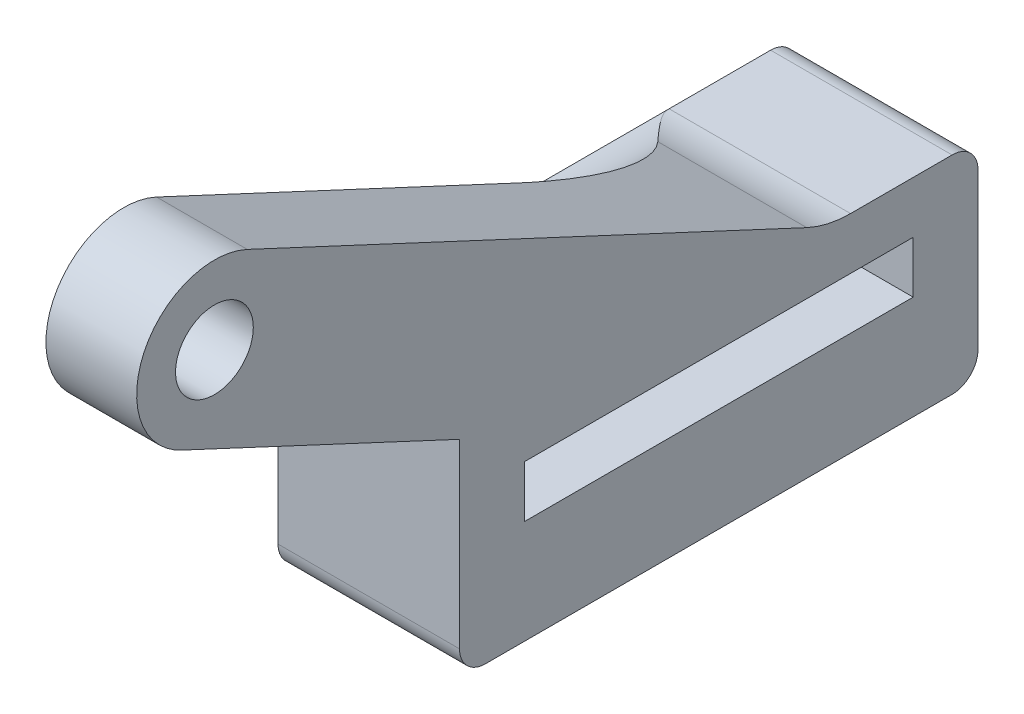
ISO-10303-21;
HEADER;
FILE_DESCRIPTION(('STEP AP214'),'2;1');
FILE_NAME('part.step','',(''),(''),'','','');
FILE_SCHEMA(('AUTOMOTIVE_DESIGN { 1 0 10303 214 1 1 1 1 }'));
ENDSEC;
DATA;
#1=APPLICATION_CONTEXT('core data for automotive mechanical design processes');
#2=APPLICATION_PROTOCOL_DEFINITION('international standard','automotive_design',2000,#1);
#3=PRODUCT_CONTEXT('',#1,'mechanical');
#4=PRODUCT('Part','Part','',(#3));
#5=PRODUCT_RELATED_PRODUCT_CATEGORY('part','',(#4));
#6=PRODUCT_DEFINITION_FORMATION('','',#4);
#7=PRODUCT_DEFINITION_CONTEXT('part definition',#1,'design');
#8=PRODUCT_DEFINITION('design','',#6,#7);
#9=PRODUCT_DEFINITION_SHAPE('','',#8);
#10=(LENGTH_UNIT() NAMED_UNIT(*) SI_UNIT(.MILLI.,.METRE.));
#11=(NAMED_UNIT(*) PLANE_ANGLE_UNIT() SI_UNIT($,.RADIAN.));
#12=(NAMED_UNIT(*) SI_UNIT($,.STERADIAN.) SOLID_ANGLE_UNIT());
#13=UNCERTAINTY_MEASURE_WITH_UNIT(LENGTH_MEASURE(1.E-05),#10,'distance_accuracy_value','');
#14=(GEOMETRIC_REPRESENTATION_CONTEXT(3) GLOBAL_UNCERTAINTY_ASSIGNED_CONTEXT((#13)) GLOBAL_UNIT_ASSIGNED_CONTEXT((#10,
#11,#12)) REPRESENTATION_CONTEXT('',''));
#15=CARTESIAN_POINT('',(0.,0.,0.));
#16=DIRECTION('',(0.,0.,1.));
#17=DIRECTION('',(1.,0.,0.));
#18=AXIS2_PLACEMENT_3D('',#15,#16,#17);
#19=CARTESIAN_POINT('',(3.5,11.7189233611099,19.4546798173259));
#20=DIRECTION('',(1.,0.,0.));
#21=DIRECTION('',(0.,0.,-1.));
#22=AXIS2_PLACEMENT_3D('',#19,#20,#21);
#23=PLANE('',#22);
#24=DIRECTION('',(0.,0.,1.));
#25=VECTOR('',#24,1.);
#26=CARTESIAN_POINT('',(3.5,2.,7.5));
#27=LINE('',#26,#25);
#28=CARTESIAN_POINT('',(3.5,2.,-7.5));
#29=VERTEX_POINT('',#28);
#30=CARTESIAN_POINT('',(3.5,2.,7.5));
#31=VERTEX_POINT('',#30);
#32=EDGE_CURVE('E331',#29,#31,#27,.T.);
#33=ORIENTED_EDGE('',*,*,#32,.F.);
#34=DIRECTION('',(0.,1.,0.));
#35=VECTOR('',#34,1.);
#36=CARTESIAN_POINT('',(3.5,2.,-7.5));
#37=LINE('',#36,#35);
#38=CARTESIAN_POINT('',(3.5,0.,-7.5));
#39=VERTEX_POINT('',#38);
#40=EDGE_CURVE('E329',#39,#29,#37,.T.);
#41=ORIENTED_EDGE('',*,*,#40,.F.);
#42=DIRECTION('',(0.,0.,-1.));
#43=VECTOR('',#42,1.);
#44=CARTESIAN_POINT('',(3.5,0.,7.5));
#45=LINE('',#44,#43);
#46=CARTESIAN_POINT('',(3.5,0.,7.5));
#47=VERTEX_POINT('',#46);
#48=EDGE_CURVE('E337',#47,#39,#45,.T.);
#49=ORIENTED_EDGE('',*,*,#48,.F.);
#50=DIRECTION('',(0.,-1.,0.));
#51=VECTOR('',#50,1.);
#52=CARTESIAN_POINT('',(3.5,2.,7.5));
#53=LINE('',#52,#51);
#54=EDGE_CURVE('E334',#31,#47,#53,.T.);
#55=ORIENTED_EDGE('',*,*,#54,.F.);
#56=EDGE_LOOP('',(#33,#41,#49,#55));
#57=FACE_BOUND('',#56,.T.);
#58=DIRECTION('',(0.,0.,-1.));
#59=VECTOR('',#58,1.);
#60=CARTESIAN_POINT('',(3.5,-4.,10.));
#61=LINE('',#60,#59);
#62=CARTESIAN_POINT('',(3.5,-4.,9.));
#63=VERTEX_POINT('',#62);
#64=CARTESIAN_POINT('',(3.5,-4.,-9.));
#65=VERTEX_POINT('',#64);
#66=EDGE_CURVE('E293',#63,#65,#61,.T.);
#67=ORIENTED_EDGE('',*,*,#66,.T.);
#68=CARTESIAN_POINT('',(3.5,-3.,-9.));
#69=DIRECTION('',(1.,0.,0.));
#70=DIRECTION('',(0.,0.,-1.));
#71=AXIS2_PLACEMENT_3D('',#68,#69,#70);
#72=CIRCLE('',#71,1.);
#73=CARTESIAN_POINT('',(3.5,-3.,-10.));
#74=VERTEX_POINT('',#73);
#75=EDGE_CURVE('E274',#65,#74,#72,.T.);
#76=ORIENTED_EDGE('',*,*,#75,.T.);
#77=DIRECTION('',(0.,1.,0.));
#78=VECTOR('',#77,1.);
#79=CARTESIAN_POINT('',(3.5,4.,-10.));
#80=LINE('',#79,#78);
#81=CARTESIAN_POINT('',(3.5,3.,-10.));
#82=VERTEX_POINT('',#81);
#83=EDGE_CURVE('E263',#74,#82,#80,.T.);
#84=ORIENTED_EDGE('',*,*,#83,.T.);
#85=CARTESIAN_POINT('',(3.5,3.,-9.));
#86=DIRECTION('',(1.,0.,0.));
#87=DIRECTION('',(0.,0.,-1.));
#88=AXIS2_PLACEMENT_3D('',#85,#86,#87);
#89=CIRCLE('',#88,1.);
#90=CARTESIAN_POINT('',(3.5,4.,-9.));
#91=VERTEX_POINT('',#90);
#92=EDGE_CURVE('E54',#82,#91,#89,.T.);
#93=ORIENTED_EDGE('',*,*,#92,.T.);
#94=DIRECTION('',(0.,0.,1.));
#95=VECTOR('',#94,1.);
#96=CARTESIAN_POINT('',(3.5,4.,-4.19720949891519));
#97=LINE('',#96,#95);
#98=CARTESIAN_POINT('',(3.5,4.,-5.08398814948693));
#99=VERTEX_POINT('',#98);
#100=EDGE_CURVE('E269',#91,#99,#97,.T.);
#101=ORIENTED_EDGE('',*,*,#100,.T.);
#102=CARTESIAN_POINT('',(3.5,8.,-5.08398814948693));
#103=DIRECTION('',(1.,0.,0.));
#104=DIRECTION('',(0.,0.,-1.));
#105=AXIS2_PLACEMENT_3D('',#102,#103,#104);
#106=CIRCLE('',#105,4.);
#107=CARTESIAN_POINT('',(3.5,4.37476885185339,-3.39351510252416));
#108=VERTEX_POINT('',#107);
#109=EDGE_CURVE('E193',#99,#108,#106,.F.);
#110=ORIENTED_EDGE('',*,*,#109,.T.);
#111=DIRECTION('',(0.,0.422618261740693,0.906307787036653));
#112=VECTOR('',#111,1.);
#113=CARTESIAN_POINT('',(3.5,4.,-4.19720949891519));
#114=LINE('',#113,#112);
#115=CARTESIAN_POINT('',(3.5,14.4378467222199,18.1868250321038));
#116=VERTEX_POINT('',#115);
#117=EDGE_CURVE('E359',#108,#116,#114,.T.);
#118=ORIENTED_EDGE('',*,*,#117,.T.);
#119=CARTESIAN_POINT('',(3.5,11.7189233611099,19.4546798173259));
#120=DIRECTION('',(1.,0.,0.));
#121=DIRECTION('',(0.,0.,-1.));
#122=AXIS2_PLACEMENT_3D('',#119,#120,#121);
#123=CIRCLE('',#122,2.99999999999999);
#124=CARTESIAN_POINT('',(3.5,9.,20.722534602548));
#125=VERTEX_POINT('',#124);
#126=EDGE_CURVE('E171',#116,#125,#123,.T.);
#127=ORIENTED_EDGE('',*,*,#126,.T.);
#128=DIRECTION('',(0.,-0.422618261740694,-0.906307787036653));
#129=VECTOR('',#128,1.);
#130=CARTESIAN_POINT('',(3.5,4.,10.));
#131=LINE('',#130,#129);
#132=CARTESIAN_POINT('',(3.5,4.,10.));
#133=VERTEX_POINT('',#132);
#134=EDGE_CURVE('E297',#125,#133,#131,.T.);
#135=ORIENTED_EDGE('',*,*,#134,.T.);
#136=DIRECTION('',(0.,-1.,0.));
#137=VECTOR('',#136,1.);
#138=CARTESIAN_POINT('',(3.5,4.,10.));
#139=LINE('',#138,#137);
#140=CARTESIAN_POINT('',(3.5,-3.,10.));
#141=VERTEX_POINT('',#140);
#142=EDGE_CURVE('E295',#133,#141,#139,.T.);
#143=ORIENTED_EDGE('',*,*,#142,.T.);
#144=CARTESIAN_POINT('',(3.5,-3.,9.));
#145=DIRECTION('',(1.,0.,0.));
#146=DIRECTION('',(0.,0.,-1.));
#147=AXIS2_PLACEMENT_3D('',#144,#145,#146);
#148=CIRCLE('',#147,1.);
#149=EDGE_CURVE('E288',#141,#63,#148,.T.);
#150=ORIENTED_EDGE('',*,*,#149,.T.);
#151=EDGE_LOOP('',(#67,#76,#84,#93,#101,#110,#118,#127,#135,#143,#150));
#152=FACE_BOUND('',#151,.T.);
#153=CARTESIAN_POINT('',(3.5,11.7189233611099,19.4546798173259));
#154=DIRECTION('',(1.,0.,0.));
#155=DIRECTION('',(0.,0.,-1.));
#156=AXIS2_PLACEMENT_3D('',#153,#154,#155);
#157=CIRCLE('',#156,1.5);
#158=CARTESIAN_POINT('',(3.5,11.7189233611099,17.9546798173259));
#159=VERTEX_POINT('',#158);
#160=EDGE_CURVE('E183',#159,#159,#157,.T.);
#161=ORIENTED_EDGE('',*,*,#160,.F.);
#162=EDGE_LOOP('',(#161));
#163=FACE_BOUND('',#162,.T.);
#164=ADVANCED_FACE('F32',(#57,#152,#163),#23,.T.);
#165=CARTESIAN_POINT('',(-3.5,11.7189233611099,19.4546798173259));
#166=DIRECTION('',(1.,0.,0.));
#167=DIRECTION('',(0.,0.,-1.));
#168=AXIS2_PLACEMENT_3D('',#165,#166,#167);
#169=PLANE('',#168);
#170=DIRECTION('',(0.,1.,0.));
#171=VECTOR('',#170,1.);
#172=CARTESIAN_POINT('',(-3.5,4.,-10.));
#173=LINE('',#172,#171);
#174=CARTESIAN_POINT('',(-3.5,-3.,-10.));
#175=VERTEX_POINT('',#174);
#176=CARTESIAN_POINT('',(-3.5,3.,-10.));
#177=VERTEX_POINT('',#176);
#178=EDGE_CURVE('E301',#175,#177,#173,.T.);
#179=ORIENTED_EDGE('',*,*,#178,.F.);
#180=CARTESIAN_POINT('',(-3.5,-3.,-9.));
#181=DIRECTION('',(1.,0.,0.));
#182=DIRECTION('',(0.,0.,-1.));
#183=AXIS2_PLACEMENT_3D('',#180,#181,#182);
#184=CIRCLE('',#183,1.);
#185=CARTESIAN_POINT('',(-3.5,-4.,-9.));
#186=VERTEX_POINT('',#185);
#187=EDGE_CURVE('E275',#175,#186,#184,.F.);
#188=ORIENTED_EDGE('',*,*,#187,.T.);
#189=DIRECTION('',(0.,0.,-1.));
#190=VECTOR('',#189,1.);
#191=CARTESIAN_POINT('',(-3.5,-4.,10.));
#192=LINE('',#191,#190);
#193=CARTESIAN_POINT('',(-3.5,-4.,9.));
#194=VERTEX_POINT('',#193);
#195=EDGE_CURVE('E270',#194,#186,#192,.T.);
#196=ORIENTED_EDGE('',*,*,#195,.F.);
#197=CARTESIAN_POINT('',(-3.5,-3.,9.));
#198=DIRECTION('',(1.,0.,0.));
#199=DIRECTION('',(0.,0.,-1.));
#200=AXIS2_PLACEMENT_3D('',#197,#198,#199);
#201=CIRCLE('',#200,1.);
#202=CARTESIAN_POINT('',(-3.5,-3.,10.));
#203=VERTEX_POINT('',#202);
#204=EDGE_CURVE('E277',#194,#203,#201,.F.);
#205=ORIENTED_EDGE('',*,*,#204,.T.);
#206=DIRECTION('',(0.,-1.,0.));
#207=VECTOR('',#206,1.);
#208=CARTESIAN_POINT('',(-3.5,4.,10.));
#209=LINE('',#208,#207);
#210=CARTESIAN_POINT('',(-3.5,4.,10.));
#211=VERTEX_POINT('',#210);
#212=EDGE_CURVE('E307',#211,#203,#209,.T.);
#213=ORIENTED_EDGE('',*,*,#212,.F.);
#214=DIRECTION('',(0.,0.,1.));
#215=VECTOR('',#214,1.);
#216=CARTESIAN_POINT('',(-3.5,4.,-4.19720949891519));
#217=LINE('',#216,#215);
#218=CARTESIAN_POINT('',(-3.5,4.,-5.08398814948693));
#219=VERTEX_POINT('',#218);
#220=EDGE_CURVE('E303',#219,#211,#217,.T.);
#221=ORIENTED_EDGE('',*,*,#220,.F.);
#222=CARTESIAN_POINT('',(-3.5,4.,-9.));
#223=VERTEX_POINT('',#222);
#224=EDGE_CURVE('E305',#223,#219,#217,.T.);
#225=ORIENTED_EDGE('',*,*,#224,.F.);
#226=CARTESIAN_POINT('',(-3.5,3.,-9.));
#227=DIRECTION('',(1.,0.,0.));
#228=DIRECTION('',(0.,0.,-1.));
#229=AXIS2_PLACEMENT_3D('',#226,#227,#228);
#230=CIRCLE('',#229,1.);
#231=EDGE_CURVE('E276',#223,#177,#230,.F.);
#232=ORIENTED_EDGE('',*,*,#231,.T.);
#233=EDGE_LOOP('',(#179,#188,#196,#205,#213,#221,#225,#232));
#234=FACE_BOUND('',#233,.T.);
#235=DIRECTION('',(0.,1.,0.));
#236=VECTOR('',#235,1.);
#237=CARTESIAN_POINT('',(-3.5,2.,-7.5));
#238=LINE('',#237,#236);
#239=CARTESIAN_POINT('',(-3.5,0.,-7.5));
#240=VERTEX_POINT('',#239);
#241=CARTESIAN_POINT('',(-3.5,2.,-7.5));
#242=VERTEX_POINT('',#241);
#243=EDGE_CURVE('E328',#240,#242,#238,.T.);
#244=ORIENTED_EDGE('',*,*,#243,.T.);
#245=DIRECTION('',(0.,0.,1.));
#246=VECTOR('',#245,1.);
#247=CARTESIAN_POINT('',(-3.5,2.,7.5));
#248=LINE('',#247,#246);
#249=CARTESIAN_POINT('',(-3.5,2.,7.5));
#250=VERTEX_POINT('',#249);
#251=EDGE_CURVE('E342',#242,#250,#248,.T.);
#252=ORIENTED_EDGE('',*,*,#251,.T.);
#253=DIRECTION('',(0.,-1.,0.));
#254=VECTOR('',#253,1.);
#255=CARTESIAN_POINT('',(-3.5,2.,7.5));
#256=LINE('',#255,#254);
#257=CARTESIAN_POINT('',(-3.5,0.,7.5));
#258=VERTEX_POINT('',#257);
#259=EDGE_CURVE('E345',#250,#258,#256,.T.);
#260=ORIENTED_EDGE('',*,*,#259,.T.);
#261=DIRECTION('',(0.,0.,-1.));
#262=VECTOR('',#261,1.);
#263=CARTESIAN_POINT('',(-3.5,0.,7.5));
#264=LINE('',#263,#262);
#265=EDGE_CURVE('E332',#258,#240,#264,.T.);
#266=ORIENTED_EDGE('',*,*,#265,.T.);
#267=EDGE_LOOP('',(#244,#252,#260,#266));
#268=FACE_BOUND('',#267,.T.);
#269=ADVANCED_FACE('F225',(#234,#268),#169,.F.);
#270=CARTESIAN_POINT('',(3.5,4.,-10.));
#271=DIRECTION('',(0.,0.,1.));
#272=DIRECTION('',(1.,0.,0.));
#273=AXIS2_PLACEMENT_3D('',#270,#271,#272);
#274=PLANE('',#273);
#275=ORIENTED_EDGE('',*,*,#83,.F.);
#276=DIRECTION('',(-1.,0.,0.));
#277=VECTOR('',#276,1.);
#278=CARTESIAN_POINT('',(3.5,-3.,-10.));
#279=LINE('',#278,#277);
#280=EDGE_CURVE('E266',#74,#175,#279,.T.);
#281=ORIENTED_EDGE('',*,*,#280,.T.);
#282=ORIENTED_EDGE('',*,*,#178,.T.);
#283=DIRECTION('',(-1.,0.,0.));
#284=VECTOR('',#283,1.);
#285=CARTESIAN_POINT('',(3.5,3.,-10.));
#286=LINE('',#285,#284);
#287=EDGE_CURVE('E195',#177,#82,#286,.F.);
#288=ORIENTED_EDGE('',*,*,#287,.T.);
#289=EDGE_LOOP('',(#275,#281,#282,#288));
#290=FACE_BOUND('',#289,.T.);
#291=ADVANCED_FACE('F231',(#290),#274,.F.);
#292=CARTESIAN_POINT('',(3.5,4.,-4.19720949891519));
#293=DIRECTION('',(0.,-1.,0.));
#294=DIRECTION('',(0.,0.,-1.));
#295=AXIS2_PLACEMENT_3D('',#292,#293,#294);
#296=PLANE('',#295);
#297=ORIENTED_EDGE('',*,*,#100,.F.);
#298=DIRECTION('',(-1.,0.,0.));
#299=VECTOR('',#298,1.);
#300=CARTESIAN_POINT('',(3.5,4.,-9.));
#301=LINE('',#300,#299);
#302=EDGE_CURVE('E11',#91,#223,#301,.T.);
#303=ORIENTED_EDGE('',*,*,#302,.T.);
#304=ORIENTED_EDGE('',*,*,#224,.T.);
#305=DIRECTION('',(-1.,0.,0.));
#306=VECTOR('',#305,1.);
#307=CARTESIAN_POINT('',(3.5,4.,-5.08398814948693));
#308=LINE('',#307,#306);
#309=EDGE_CURVE('E175',#219,#99,#308,.F.);
#310=ORIENTED_EDGE('',*,*,#309,.T.);
#311=EDGE_LOOP('',(#297,#303,#304,#310));
#312=FACE_BOUND('',#311,.T.);
#313=ADVANCED_FACE('F254',(#312),#296,.F.);
#314=CARTESIAN_POINT('',(3.5,4.,-4.19720949891519));
#315=DIRECTION('',(0.,-0.906307787036653,0.422618261740693));
#316=DIRECTION('',(0.,-0.422618261740693,-0.906307787036653));
#317=AXIS2_PLACEMENT_3D('',#314,#315,#316);
#318=PLANE('',#317);
#319=ORIENTED_EDGE('',*,*,#117,.F.);
#320=DIRECTION('',(-1.,0.,0.));
#321=VECTOR('',#320,1.);
#322=CARTESIAN_POINT('',(0.,4.37476885185339,-3.39351510252416));
#323=LINE('',#322,#321);
#324=CARTESIAN_POINT('',(-2.24381554183727,4.37476885185339,-3.39351510252416));
#325=VERTEX_POINT('',#324);
#326=EDGE_CURVE('E187',#108,#325,#323,.T.);
#327=ORIENTED_EDGE('',*,*,#326,.T.);
#328=CARTESIAN_POINT('',(-4.,7.96862696659689,4.31353849587285));
#329=DIRECTION('',(0.,-0.906307787036653,0.422618261740693));
#330=DIRECTION('',(0.,0.422618261740693,0.906307787036653));
#331=AXIS2_PLACEMENT_3D('',#328,#329,#330);
#332=ELLIPSE('',#331,9.46480633261013,4.);
#333=CARTESIAN_POINT('',(0.,7.96862696659689,4.31353849587285));
#334=VERTEX_POINT('',#333);
#335=EDGE_CURVE('E168',#325,#334,#332,.T.);
#336=ORIENTED_EDGE('',*,*,#335,.T.);
#337=DIRECTION('',(0.,-0.422618261740693,-0.906307787036653));
#338=VECTOR('',#337,1.);
#339=CARTESIAN_POINT('',(0.,14.4378467222199,18.1868250321038));
#340=LINE('',#339,#338);
#341=CARTESIAN_POINT('',(0.,14.4378467222199,18.1868250321038));
#342=VERTEX_POINT('',#341);
#343=EDGE_CURVE('E151',#342,#334,#340,.T.);
#344=ORIENTED_EDGE('',*,*,#343,.F.);
#345=DIRECTION('',(-1.,0.,0.));
#346=VECTOR('',#345,1.);
#347=CARTESIAN_POINT('',(3.5,14.4378467222199,18.1868250321038));
#348=LINE('',#347,#346);
#349=EDGE_CURVE('E165',#116,#342,#348,.T.);
#350=ORIENTED_EDGE('',*,*,#349,.F.);
#351=EDGE_LOOP('',(#319,#327,#336,#344,#350));
#352=FACE_BOUND('',#351,.T.);
#353=ADVANCED_FACE('F164',(#352),#318,.F.);
#354=CARTESIAN_POINT('',(3.5,11.7189233611099,19.4546798173259));
#355=DIRECTION('',(-1.,0.,0.));
#356=DIRECTION('',(0.,0.,1.));
#357=AXIS2_PLACEMENT_3D('',#354,#355,#356);
#358=CYLINDRICAL_SURFACE('',#357,2.99999999999999);
#359=ORIENTED_EDGE('',*,*,#349,.T.);
#360=CARTESIAN_POINT('',(0.,11.7189233611099,19.4546798173259));
#361=DIRECTION('',(1.,0.,0.));
#362=DIRECTION('',(0.,0.,-1.));
#363=AXIS2_PLACEMENT_3D('',#360,#361,#362);
#364=CIRCLE('',#363,2.99999999999999);
#365=CARTESIAN_POINT('',(0.,9.,20.722534602548));
#366=VERTEX_POINT('',#365);
#367=EDGE_CURVE('E147',#366,#342,#364,.F.);
#368=ORIENTED_EDGE('',*,*,#367,.F.);
#369=DIRECTION('',(-1.,0.,0.));
#370=VECTOR('',#369,1.);
#371=CARTESIAN_POINT('',(3.5,9.,20.722534602548));
#372=LINE('',#371,#370);
#373=EDGE_CURVE('E173',#125,#366,#372,.T.);
#374=ORIENTED_EDGE('',*,*,#373,.F.);
#375=ORIENTED_EDGE('',*,*,#126,.F.);
#376=EDGE_LOOP('',(#359,#368,#374,#375));
#377=FACE_BOUND('',#376,.T.);
#378=ADVANCED_FACE('F170',(#377),#358,.T.);
#379=CARTESIAN_POINT('',(3.5,4.,10.));
#380=DIRECTION('',(0.,0.906307787036653,-0.422618261740694));
#381=DIRECTION('',(0.,0.422618261740694,0.906307787036653));
#382=AXIS2_PLACEMENT_3D('',#379,#380,#381);
#383=PLANE('',#382);
#384=ORIENTED_EDGE('',*,*,#373,.T.);
#385=DIRECTION('',(0.,0.422618261740694,0.906307787036653));
#386=VECTOR('',#385,1.);
#387=CARTESIAN_POINT('',(0.,4.,10.));
#388=LINE('',#387,#386);
#389=CARTESIAN_POINT('',(0.,7.96862696659689,18.510747994788));
#390=VERTEX_POINT('',#389);
#391=EDGE_CURVE('E154',#390,#366,#388,.T.);
#392=ORIENTED_EDGE('',*,*,#391,.F.);
#393=CARTESIAN_POINT('',(-4.,7.96862696659689,18.510747994788));
#394=DIRECTION('',(0.,0.906307787036653,-0.422618261740694));
#395=DIRECTION('',(0.,0.422618261740694,0.906307787036653));
#396=AXIS2_PLACEMENT_3D('',#393,#394,#395);
#397=ELLIPSE('',#396,9.46480633261012,4.);
#398=EDGE_CURVE('E189',#390,#211,#397,.T.);
#399=ORIENTED_EDGE('',*,*,#398,.T.);
#400=DIRECTION('',(-1.,0.,0.));
#401=VECTOR('',#400,1.);
#402=CARTESIAN_POINT('',(3.5,4.,10.));
#403=LINE('',#402,#401);
#404=EDGE_CURVE('E177',#133,#211,#403,.T.);
#405=ORIENTED_EDGE('',*,*,#404,.F.);
#406=ORIENTED_EDGE('',*,*,#134,.F.);
#407=EDGE_LOOP('',(#384,#392,#399,#405,#406));
#408=FACE_BOUND('',#407,.T.);
#409=ADVANCED_FACE('F246',(#408),#383,.F.);
#410=CARTESIAN_POINT('',(3.5,4.,10.));
#411=DIRECTION('',(0.,0.,-1.));
#412=DIRECTION('',(-1.,0.,0.));
#413=AXIS2_PLACEMENT_3D('',#410,#411,#412);
#414=PLANE('',#413);
#415=ORIENTED_EDGE('',*,*,#212,.T.);
#416=DIRECTION('',(-1.,0.,0.));
#417=VECTOR('',#416,1.);
#418=CARTESIAN_POINT('',(3.5,-3.,10.));
#419=LINE('',#418,#417);
#420=EDGE_CURVE('E40',#203,#141,#419,.F.);
#421=ORIENTED_EDGE('',*,*,#420,.T.);
#422=ORIENTED_EDGE('',*,*,#142,.F.);
#423=ORIENTED_EDGE('',*,*,#404,.T.);
#424=EDGE_LOOP('',(#415,#421,#422,#423));
#425=FACE_BOUND('',#424,.T.);
#426=ADVANCED_FACE('F242',(#425),#414,.F.);
#427=CARTESIAN_POINT('',(3.5,-4.,10.));
#428=DIRECTION('',(0.,1.,0.));
#429=DIRECTION('',(0.,0.,1.));
#430=AXIS2_PLACEMENT_3D('',#427,#428,#429);
#431=PLANE('',#430);
#432=ORIENTED_EDGE('',*,*,#195,.T.);
#433=DIRECTION('',(-1.,0.,0.));
#434=VECTOR('',#433,1.);
#435=CARTESIAN_POINT('',(3.5,-4.,-9.));
#436=LINE('',#435,#434);
#437=EDGE_CURVE('E285',#186,#65,#436,.F.);
#438=ORIENTED_EDGE('',*,*,#437,.T.);
#439=ORIENTED_EDGE('',*,*,#66,.F.);
#440=DIRECTION('',(-1.,0.,0.));
#441=VECTOR('',#440,1.);
#442=CARTESIAN_POINT('',(3.5,-4.,9.));
#443=LINE('',#442,#441);
#444=EDGE_CURVE('E282',#63,#194,#443,.T.);
#445=ORIENTED_EDGE('',*,*,#444,.T.);
#446=EDGE_LOOP('',(#432,#438,#439,#445));
#447=FACE_BOUND('',#446,.T.);
#448=ADVANCED_FACE('F239',(#447),#431,.F.);
#449=CARTESIAN_POINT('',(3.5,2.,-7.5));
#450=DIRECTION('',(0.,0.,1.));
#451=DIRECTION('',(1.,0.,0.));
#452=AXIS2_PLACEMENT_3D('',#449,#450,#451);
#453=PLANE('',#452);
#454=ORIENTED_EDGE('',*,*,#243,.F.);
#455=DIRECTION('',(-1.,0.,0.));
#456=VECTOR('',#455,1.);
#457=CARTESIAN_POINT('',(3.5,0.,-7.5));
#458=LINE('',#457,#456);
#459=EDGE_CURVE('E339',#39,#240,#458,.T.);
#460=ORIENTED_EDGE('',*,*,#459,.F.);
#461=ORIENTED_EDGE('',*,*,#40,.T.);
#462=DIRECTION('',(-1.,0.,0.));
#463=VECTOR('',#462,1.);
#464=CARTESIAN_POINT('',(3.5,2.,-7.5));
#465=LINE('',#464,#463);
#466=EDGE_CURVE('E304',#29,#242,#465,.T.);
#467=ORIENTED_EDGE('',*,*,#466,.T.);
#468=EDGE_LOOP('',(#454,#460,#461,#467));
#469=FACE_BOUND('',#468,.T.);
#470=ADVANCED_FACE('F236',(#469),#453,.T.);
#471=CARTESIAN_POINT('',(3.5,2.,7.5));
#472=DIRECTION('',(0.,-1.,0.));
#473=DIRECTION('',(0.,0.,-1.));
#474=AXIS2_PLACEMENT_3D('',#471,#472,#473);
#475=PLANE('',#474);
#476=ORIENTED_EDGE('',*,*,#251,.F.);
#477=ORIENTED_EDGE('',*,*,#466,.F.);
#478=ORIENTED_EDGE('',*,*,#32,.T.);
#479=DIRECTION('',(-1.,0.,0.));
#480=VECTOR('',#479,1.);
#481=CARTESIAN_POINT('',(3.5,2.,7.5));
#482=LINE('',#481,#480);
#483=EDGE_CURVE('E354',#31,#250,#482,.T.);
#484=ORIENTED_EDGE('',*,*,#483,.T.);
#485=EDGE_LOOP('',(#476,#477,#478,#484));
#486=FACE_BOUND('',#485,.T.);
#487=ADVANCED_FACE('F373',(#486),#475,.T.);
#488=CARTESIAN_POINT('',(3.5,2.,7.5));
#489=DIRECTION('',(0.,0.,-1.));
#490=DIRECTION('',(-1.,0.,0.));
#491=AXIS2_PLACEMENT_3D('',#488,#489,#490);
#492=PLANE('',#491);
#493=ORIENTED_EDGE('',*,*,#259,.F.);
#494=ORIENTED_EDGE('',*,*,#483,.F.);
#495=ORIENTED_EDGE('',*,*,#54,.T.);
#496=DIRECTION('',(-1.,0.,0.));
#497=VECTOR('',#496,1.);
#498=CARTESIAN_POINT('',(3.5,0.,7.5));
#499=LINE('',#498,#497);
#500=EDGE_CURVE('E352',#47,#258,#499,.T.);
#501=ORIENTED_EDGE('',*,*,#500,.T.);
#502=EDGE_LOOP('',(#493,#494,#495,#501));
#503=FACE_BOUND('',#502,.T.);
#504=ADVANCED_FACE('F375',(#503),#492,.T.);
#505=CARTESIAN_POINT('',(3.5,0.,7.5));
#506=DIRECTION('',(0.,1.,0.));
#507=DIRECTION('',(0.,0.,1.));
#508=AXIS2_PLACEMENT_3D('',#505,#506,#507);
#509=PLANE('',#508);
#510=ORIENTED_EDGE('',*,*,#265,.F.);
#511=ORIENTED_EDGE('',*,*,#500,.F.);
#512=ORIENTED_EDGE('',*,*,#48,.T.);
#513=ORIENTED_EDGE('',*,*,#459,.T.);
#514=EDGE_LOOP('',(#510,#511,#512,#513));
#515=FACE_BOUND('',#514,.T.);
#516=ADVANCED_FACE('F369',(#515),#509,.T.);
#517=CARTESIAN_POINT('',(3.5,11.7189233611099,19.4546798173259));
#518=DIRECTION('',(-1.,0.,0.));
#519=DIRECTION('',(0.,0.,1.));
#520=AXIS2_PLACEMENT_3D('',#517,#518,#519);
#521=CYLINDRICAL_SURFACE('',#520,1.5);
#522=CARTESIAN_POINT('',(0.,11.7189233611099,19.4546798173259));
#523=DIRECTION('',(1.,0.,0.));
#524=DIRECTION('',(0.,0.,-1.));
#525=AXIS2_PLACEMENT_3D('',#522,#523,#524);
#526=CIRCLE('',#525,1.5);
#527=CARTESIAN_POINT('',(0.,11.7189233611099,17.9546798173259));
#528=VERTEX_POINT('',#527);
#529=EDGE_CURVE('E181',#528,#528,#526,.T.);
#530=ORIENTED_EDGE('',*,*,#529,.F.);
#531=EDGE_LOOP('',(#530));
#532=FACE_BOUND('',#531,.T.);
#533=ORIENTED_EDGE('',*,*,#160,.T.);
#534=EDGE_LOOP('',(#533));
#535=FACE_BOUND('',#534,.T.);
#536=ADVANCED_FACE('F382',(#532,#535),#521,.F.);
#537=CARTESIAN_POINT('',(0.,0.,0.));
#538=DIRECTION('',(1.,0.,0.));
#539=DIRECTION('',(0.,0.,-1.));
#540=AXIS2_PLACEMENT_3D('',#537,#538,#539);
#541=PLANE('',#540);
#542=ORIENTED_EDGE('',*,*,#529,.T.);
#543=EDGE_LOOP('',(#542));
#544=FACE_BOUND('',#543,.T.);
#545=ORIENTED_EDGE('',*,*,#343,.T.);
#546=DIRECTION('',(0.,0.,1.));
#547=VECTOR('',#546,1.);
#548=CARTESIAN_POINT('',(0.,7.96862696659689,0.));
#549=LINE('',#548,#547);
#550=EDGE_CURVE('E172',#334,#390,#549,.T.);
#551=ORIENTED_EDGE('',*,*,#550,.T.);
#552=ORIENTED_EDGE('',*,*,#391,.T.);
#553=ORIENTED_EDGE('',*,*,#367,.T.);
#554=EDGE_LOOP('',(#545,#551,#552,#553));
#555=FACE_BOUND('',#554,.T.);
#556=ADVANCED_FACE('F149',(#544,#555),#541,.F.);
#557=CARTESIAN_POINT('',(3.5,8.,-5.08398814948693));
#558=DIRECTION('',(1.,0.,0.));
#559=DIRECTION('',(0.,0.,-1.));
#560=AXIS2_PLACEMENT_3D('',#557,#558,#559);
#561=CYLINDRICAL_SURFACE('',#560,4.);
#562=ORIENTED_EDGE('',*,*,#109,.F.);
#563=ORIENTED_EDGE('',*,*,#309,.F.);
#564=CARTESIAN_POINT('',(-3.5,4.,-5.08398814948693));
#565=CARTESIAN_POINT('',(-3.50020059270589,3.9999872069429,-5.04857420204012));
#566=CARTESIAN_POINT('',(-3.49627224295943,4.00046833693696,-5.0135171582656));
#567=CARTESIAN_POINT('',(-3.48228041896221,4.00226329091797,-4.94541222742524));
#568=CARTESIAN_POINT('',(-3.47235253281525,4.00355873684273,-4.91233720312202));
#569=CARTESIAN_POINT('',(-3.43427265467061,4.00875605358318,-4.81023278156608));
#570=CARTESIAN_POINT('',(-3.39838474193809,4.01393444477451,-4.7443800297233));
#571=CARTESIAN_POINT('',(-3.31812631053127,4.02694928420321,-4.61583910933205));
#572=CARTESIAN_POINT('',(-3.27350519791129,4.03487152460501,-4.55333934805178));
#573=CARTESIAN_POINT('',(-3.1868987616684,4.05192501601681,-4.4393565474964));
#574=CARTESIAN_POINT('',(-3.14534203895986,4.06075898464627,-4.38750772556693));
#575=CARTESIAN_POINT('',(-3.06082488936774,4.08020333534258,-4.28530077519285));
#576=CARTESIAN_POINT('',(-3.0178637990971,4.09081456699441,-4.23494337330514));
#577=CARTESIAN_POINT('',(-2.88776116786603,4.12532601601242,-4.0852828956543));
#578=CARTESIAN_POINT('',(-2.79951752263681,4.15188168242188,-3.987536948952));
#579=CARTESIAN_POINT('',(-2.63297332056919,4.20856487267042,-3.8061246855292));
#580=CARTESIAN_POINT('',(-2.55472710115028,4.23790213562074,-3.72215709304225));
#581=CARTESIAN_POINT('',(-2.39876137196477,4.30213830133024,-3.55635496638748));
#582=CARTESIAN_POINT('',(-2.32104100094263,4.33702140673589,-3.4745151194847));
#583=CARTESIAN_POINT('',(-2.24381554183725,4.37476885185337,-3.39351510252417));
#584=B_SPLINE_CURVE_WITH_KNOTS('',3,(#564,#565,#566,#567,#568,#569,#570,#571,#572,#573,#574,
#575,#576,#577,#578,#579,#580,#581,#582,#583),.UNSPECIFIED.,.F.,.F.,(4,2,2,2,2,2,2,2,2,4),(0.,
0.105462200825295,0.208625735711294,0.432408057567913,0.66393546191921,0.864925395968993,
1.06601168489375,1.46874750787861,1.82400060340402,2.17825931549734),.UNSPECIFIED.);
#585=EDGE_CURVE('E159',#325,#219,#584,.F.);
#586=ORIENTED_EDGE('',*,*,#585,.F.);
#587=ORIENTED_EDGE('',*,*,#326,.F.);
#588=EDGE_LOOP('',(#562,#563,#586,#587));
#589=FACE_BOUND('',#588,.T.);
#590=ADVANCED_FACE('F205',(#589),#561,.F.);
#591=CARTESIAN_POINT('',(-4.,7.96862696659689,-4.19720949891519));
#592=DIRECTION('',(0.,0.,1.));
#593=DIRECTION('',(1.,0.,0.));
#594=AXIS2_PLACEMENT_3D('',#591,#592,#593);
#595=CYLINDRICAL_SURFACE('',#594,4.);
#596=ORIENTED_EDGE('',*,*,#585,.T.);
#597=ORIENTED_EDGE('',*,*,#220,.T.);
#598=ORIENTED_EDGE('',*,*,#398,.F.);
#599=ORIENTED_EDGE('',*,*,#550,.F.);
#600=ORIENTED_EDGE('',*,*,#335,.F.);
#601=EDGE_LOOP('',(#596,#597,#598,#599,#600));
#602=FACE_BOUND('',#601,.T.);
#603=ADVANCED_FACE('F208',(#602),#595,.F.);
#604=CARTESIAN_POINT('',(3.5,-3.,-9.));
#605=DIRECTION('',(-1.,0.,0.));
#606=DIRECTION('',(0.,0.,1.));
#607=AXIS2_PLACEMENT_3D('',#604,#605,#606);
#608=CYLINDRICAL_SURFACE('',#607,1.);
#609=ORIENTED_EDGE('',*,*,#75,.F.);
#610=ORIENTED_EDGE('',*,*,#437,.F.);
#611=ORIENTED_EDGE('',*,*,#187,.F.);
#612=ORIENTED_EDGE('',*,*,#280,.F.);
#613=EDGE_LOOP('',(#609,#610,#611,#612));
#614=FACE_BOUND('',#613,.T.);
#615=ADVANCED_FACE('F212',(#614),#608,.T.);
#616=CARTESIAN_POINT('',(3.5,-3.,9.));
#617=DIRECTION('',(-1.,0.,0.));
#618=DIRECTION('',(0.,0.,1.));
#619=AXIS2_PLACEMENT_3D('',#616,#617,#618);
#620=CYLINDRICAL_SURFACE('',#619,1.);
#621=ORIENTED_EDGE('',*,*,#149,.F.);
#622=ORIENTED_EDGE('',*,*,#420,.F.);
#623=ORIENTED_EDGE('',*,*,#204,.F.);
#624=ORIENTED_EDGE('',*,*,#444,.F.);
#625=EDGE_LOOP('',(#621,#622,#623,#624));
#626=FACE_BOUND('',#625,.T.);
#627=ADVANCED_FACE('F215',(#626),#620,.T.);
#628=CARTESIAN_POINT('',(3.5,3.,-9.));
#629=DIRECTION('',(-1.,0.,0.));
#630=DIRECTION('',(0.,0.,1.));
#631=AXIS2_PLACEMENT_3D('',#628,#629,#630);
#632=CYLINDRICAL_SURFACE('',#631,1.);
#633=ORIENTED_EDGE('',*,*,#92,.F.);
#634=ORIENTED_EDGE('',*,*,#287,.F.);
#635=ORIENTED_EDGE('',*,*,#231,.F.);
#636=ORIENTED_EDGE('',*,*,#302,.F.);
#637=EDGE_LOOP('',(#633,#634,#635,#636));
#638=FACE_BOUND('',#637,.T.);
#639=ADVANCED_FACE('F34',(#638),#632,.T.);
#640=CLOSED_SHELL('',(#164,#269,#291,#313,#353,#378,#409,#426,#448,#470,#487,#504,#516,#536,
#556,#590,#603,#615,#627,#639));
#641=MANIFOLD_SOLID_BREP('B2',#640);
#642=ADVANCED_BREP_SHAPE_REPRESENTATION('',(#18,#641),#14);
#643=SHAPE_DEFINITION_REPRESENTATION(#9,#642);
ENDSEC;
END-ISO-10303-21;
